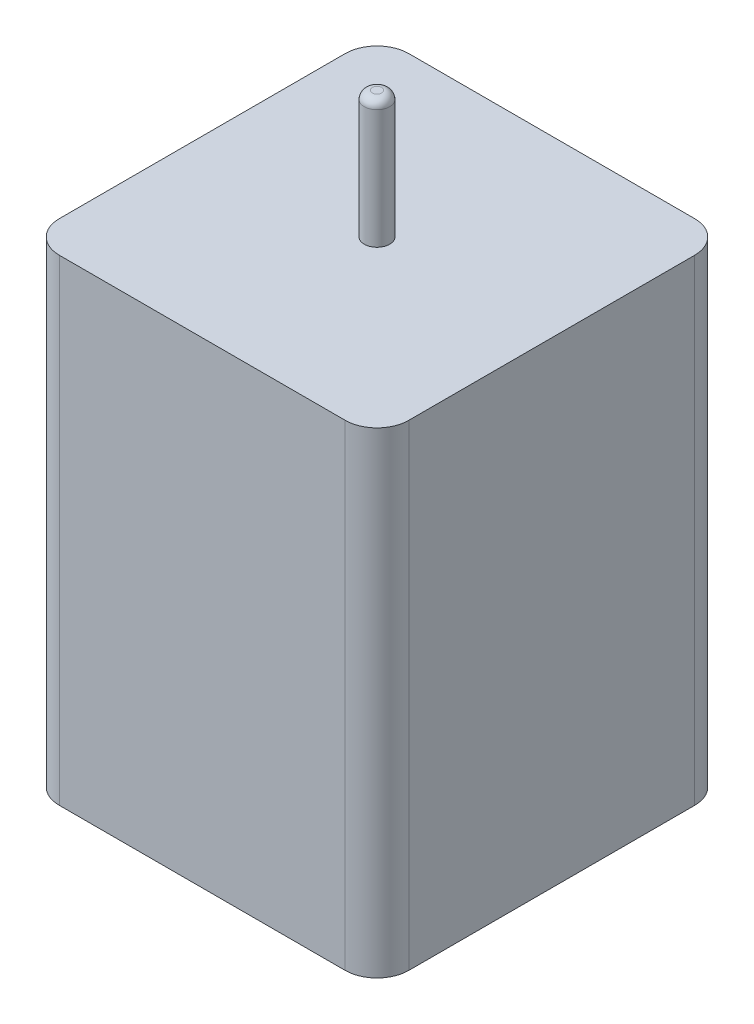
ISO-10303-21;
HEADER;
FILE_DESCRIPTION(('STEP AP214'),'2;1');
FILE_NAME('part.step','',(''),(''),'','','');
FILE_SCHEMA(('AUTOMOTIVE_DESIGN { 1 0 10303 214 1 1 1 1 }'));
ENDSEC;
DATA;
#1=APPLICATION_CONTEXT('core data for automotive mechanical design processes');
#2=APPLICATION_PROTOCOL_DEFINITION('international standard','automotive_design',2000,#1);
#3=PRODUCT_CONTEXT('',#1,'mechanical');
#4=PRODUCT('Part','Part','',(#3));
#5=PRODUCT_RELATED_PRODUCT_CATEGORY('part','',(#4));
#6=PRODUCT_DEFINITION_FORMATION('','',#4);
#7=PRODUCT_DEFINITION_CONTEXT('part definition',#1,'design');
#8=PRODUCT_DEFINITION('design','',#6,#7);
#9=PRODUCT_DEFINITION_SHAPE('','',#8);
#10=(LENGTH_UNIT() NAMED_UNIT(*) SI_UNIT(.MILLI.,.METRE.));
#11=(NAMED_UNIT(*) PLANE_ANGLE_UNIT() SI_UNIT($,.RADIAN.));
#12=(NAMED_UNIT(*) SI_UNIT($,.STERADIAN.) SOLID_ANGLE_UNIT());
#13=UNCERTAINTY_MEASURE_WITH_UNIT(LENGTH_MEASURE(1.E-05),#10,'distance_accuracy_value','');
#14=(GEOMETRIC_REPRESENTATION_CONTEXT(3) GLOBAL_UNCERTAINTY_ASSIGNED_CONTEXT((#13)) GLOBAL_UNIT_ASSIGNED_CONTEXT((#10,
#11,#12)) REPRESENTATION_CONTEXT('',''));
#15=CARTESIAN_POINT('',(0.,0.,0.));
#16=DIRECTION('',(0.,0.,1.));
#17=DIRECTION('',(1.,0.,0.));
#18=AXIS2_PLACEMENT_3D('',#15,#16,#17);
#19=CARTESIAN_POINT('',(-110.,300.,-110.));
#20=DIRECTION('',(1.,0.,0.));
#21=DIRECTION('',(0.,0.,-1.));
#22=AXIS2_PLACEMENT_3D('',#19,#20,#21);
#23=PLANE('',#22);
#24=DIRECTION('',(0.,0.,1.));
#25=VECTOR('',#24,1.);
#26=CARTESIAN_POINT('',(-110.,300.,-110.));
#27=LINE('',#26,#25);
#28=CARTESIAN_POINT('',(-110.,300.,-90.));
#29=VERTEX_POINT('',#28);
#30=CARTESIAN_POINT('',(-110.,300.,90.));
#31=VERTEX_POINT('',#30);
#32=EDGE_CURVE('E127',#29,#31,#27,.T.);
#33=ORIENTED_EDGE('',*,*,#32,.F.);
#34=DIRECTION('',(0.,-1.,0.));
#35=VECTOR('',#34,1.);
#36=CARTESIAN_POINT('',(-110.,300.,-90.));
#37=LINE('',#36,#35);
#38=CARTESIAN_POINT('',(-110.,0.,-90.));
#39=VERTEX_POINT('',#38);
#40=EDGE_CURVE('E112',#29,#39,#37,.T.);
#41=ORIENTED_EDGE('',*,*,#40,.T.);
#42=DIRECTION('',(0.,0.,1.));
#43=VECTOR('',#42,1.);
#44=CARTESIAN_POINT('',(-110.,0.,-110.));
#45=LINE('',#44,#43);
#46=CARTESIAN_POINT('',(-110.,0.,90.));
#47=VERTEX_POINT('',#46);
#48=EDGE_CURVE('E124',#39,#47,#45,.T.);
#49=ORIENTED_EDGE('',*,*,#48,.T.);
#50=DIRECTION('',(0.,-1.,0.));
#51=VECTOR('',#50,1.);
#52=CARTESIAN_POINT('',(-110.,300.,90.));
#53=LINE('',#52,#51);
#54=EDGE_CURVE('E129',#47,#31,#53,.F.);
#55=ORIENTED_EDGE('',*,*,#54,.T.);
#56=EDGE_LOOP('',(#33,#41,#49,#55));
#57=FACE_BOUND('',#56,.T.);
#58=ADVANCED_FACE('F41',(#57),#23,.F.);
#59=CARTESIAN_POINT('',(110.,300.,110.));
#60=DIRECTION('',(0.,0.,-1.));
#61=DIRECTION('',(-1.,0.,0.));
#62=AXIS2_PLACEMENT_3D('',#59,#60,#61);
#63=PLANE('',#62);
#64=DIRECTION('',(1.,0.,0.));
#65=VECTOR('',#64,1.);
#66=CARTESIAN_POINT('',(110.,0.,110.));
#67=LINE('',#66,#65);
#68=CARTESIAN_POINT('',(-90.,0.,110.));
#69=VERTEX_POINT('',#68);
#70=CARTESIAN_POINT('',(90.,0.,110.));
#71=VERTEX_POINT('',#70);
#72=EDGE_CURVE('E133',#69,#71,#67,.T.);
#73=ORIENTED_EDGE('',*,*,#72,.T.);
#74=DIRECTION('',(0.,-1.,0.));
#75=VECTOR('',#74,1.);
#76=CARTESIAN_POINT('',(90.,300.,110.));
#77=LINE('',#76,#75);
#78=CARTESIAN_POINT('',(90.,300.,110.));
#79=VERTEX_POINT('',#78);
#80=EDGE_CURVE('E170',#71,#79,#77,.F.);
#81=ORIENTED_EDGE('',*,*,#80,.T.);
#82=DIRECTION('',(1.,0.,0.));
#83=VECTOR('',#82,1.);
#84=CARTESIAN_POINT('',(110.,300.,110.));
#85=LINE('',#84,#83);
#86=CARTESIAN_POINT('',(-90.,300.,110.));
#87=VERTEX_POINT('',#86);
#88=EDGE_CURVE('E217',#87,#79,#85,.T.);
#89=ORIENTED_EDGE('',*,*,#88,.F.);
#90=DIRECTION('',(0.,-1.,0.));
#91=VECTOR('',#90,1.);
#92=CARTESIAN_POINT('',(-90.,300.,110.));
#93=LINE('',#92,#91);
#94=EDGE_CURVE('E167',#87,#69,#93,.T.);
#95=ORIENTED_EDGE('',*,*,#94,.T.);
#96=EDGE_LOOP('',(#73,#81,#89,#95));
#97=FACE_BOUND('',#96,.T.);
#98=ADVANCED_FACE('F187',(#97),#63,.F.);
#99=CARTESIAN_POINT('',(110.,300.,-110.));
#100=DIRECTION('',(-1.,0.,0.));
#101=DIRECTION('',(0.,0.,1.));
#102=AXIS2_PLACEMENT_3D('',#99,#100,#101);
#103=PLANE('',#102);
#104=DIRECTION('',(0.,0.,-1.));
#105=VECTOR('',#104,1.);
#106=CARTESIAN_POINT('',(110.,0.,-110.));
#107=LINE('',#106,#105);
#108=CARTESIAN_POINT('',(110.,0.,90.));
#109=VERTEX_POINT('',#108);
#110=CARTESIAN_POINT('',(110.,0.,-90.));
#111=VERTEX_POINT('',#110);
#112=EDGE_CURVE('E136',#109,#111,#107,.T.);
#113=ORIENTED_EDGE('',*,*,#112,.T.);
#114=DIRECTION('',(0.,-1.,0.));
#115=VECTOR('',#114,1.);
#116=CARTESIAN_POINT('',(110.,300.,-90.));
#117=LINE('',#116,#115);
#118=CARTESIAN_POINT('',(110.,300.,-90.));
#119=VERTEX_POINT('',#118);
#120=EDGE_CURVE('E56',#111,#119,#117,.F.);
#121=ORIENTED_EDGE('',*,*,#120,.T.);
#122=DIRECTION('',(0.,0.,-1.));
#123=VECTOR('',#122,1.);
#124=CARTESIAN_POINT('',(110.,300.,-110.));
#125=LINE('',#124,#123);
#126=CARTESIAN_POINT('',(110.,300.,90.));
#127=VERTEX_POINT('',#126);
#128=EDGE_CURVE('E210',#127,#119,#125,.T.);
#129=ORIENTED_EDGE('',*,*,#128,.F.);
#130=DIRECTION('',(0.,-1.,0.));
#131=VECTOR('',#130,1.);
#132=CARTESIAN_POINT('',(110.,300.,90.));
#133=LINE('',#132,#131);
#134=EDGE_CURVE('E163',#127,#109,#133,.T.);
#135=ORIENTED_EDGE('',*,*,#134,.T.);
#136=EDGE_LOOP('',(#113,#121,#129,#135));
#137=FACE_BOUND('',#136,.T.);
#138=ADVANCED_FACE('F192',(#137),#103,.F.);
#139=CARTESIAN_POINT('',(110.,300.,-110.));
#140=DIRECTION('',(0.,0.,1.));
#141=DIRECTION('',(1.,0.,0.));
#142=AXIS2_PLACEMENT_3D('',#139,#140,#141);
#143=PLANE('',#142);
#144=DIRECTION('',(-1.,0.,0.));
#145=VECTOR('',#144,1.);
#146=CARTESIAN_POINT('',(110.,0.,-110.));
#147=LINE('',#146,#145);
#148=CARTESIAN_POINT('',(90.,0.,-110.));
#149=VERTEX_POINT('',#148);
#150=CARTESIAN_POINT('',(-90.,0.,-110.));
#151=VERTEX_POINT('',#150);
#152=EDGE_CURVE('E143',#149,#151,#147,.T.);
#153=ORIENTED_EDGE('',*,*,#152,.T.);
#154=DIRECTION('',(0.,-1.,0.));
#155=VECTOR('',#154,1.);
#156=CARTESIAN_POINT('',(-90.,300.,-110.));
#157=LINE('',#156,#155);
#158=CARTESIAN_POINT('',(-90.,300.,-110.));
#159=VERTEX_POINT('',#158);
#160=EDGE_CURVE('E113',#151,#159,#157,.F.);
#161=ORIENTED_EDGE('',*,*,#160,.T.);
#162=DIRECTION('',(-1.,0.,0.));
#163=VECTOR('',#162,1.);
#164=CARTESIAN_POINT('',(110.,300.,-110.));
#165=LINE('',#164,#163);
#166=CARTESIAN_POINT('',(90.,300.,-110.));
#167=VERTEX_POINT('',#166);
#168=EDGE_CURVE('E139',#167,#159,#165,.T.);
#169=ORIENTED_EDGE('',*,*,#168,.F.);
#170=DIRECTION('',(0.,-1.,0.));
#171=VECTOR('',#170,1.);
#172=CARTESIAN_POINT('',(90.,300.,-110.));
#173=LINE('',#172,#171);
#174=EDGE_CURVE('E118',#167,#149,#173,.T.);
#175=ORIENTED_EDGE('',*,*,#174,.T.);
#176=EDGE_LOOP('',(#153,#161,#169,#175));
#177=FACE_BOUND('',#176,.T.);
#178=ADVANCED_FACE('F215',(#177),#143,.F.);
#179=CARTESIAN_POINT('',(0.,300.,0.));
#180=DIRECTION('',(0.,-1.,0.));
#181=DIRECTION('',(0.,0.,-1.));
#182=AXIS2_PLACEMENT_3D('',#179,#180,#181);
#183=PLANE('',#182);
#184=CARTESIAN_POINT('',(0.,300.,0.));
#185=DIRECTION('',(0.,-1.,0.));
#186=DIRECTION('',(0.,0.,-1.));
#187=AXIS2_PLACEMENT_3D('',#184,#185,#186);
#188=CIRCLE('',#187,8.);
#189=CARTESIAN_POINT('',(0.,300.,-8.));
#190=VERTEX_POINT('',#189);
#191=EDGE_CURVE('E145',#190,#190,#188,.F.);
#192=ORIENTED_EDGE('',*,*,#191,.F.);
#193=EDGE_LOOP('',(#192));
#194=FACE_BOUND('',#193,.T.);
#195=ORIENTED_EDGE('',*,*,#168,.T.);
#196=CARTESIAN_POINT('',(-90.,300.,-90.));
#197=DIRECTION('',(0.,-1.,0.));
#198=DIRECTION('',(0.,0.,-1.));
#199=AXIS2_PLACEMENT_3D('',#196,#197,#198);
#200=CIRCLE('',#199,20.);
#201=EDGE_CURVE('E161',#159,#29,#200,.F.);
#202=ORIENTED_EDGE('',*,*,#201,.T.);
#203=ORIENTED_EDGE('',*,*,#32,.T.);
#204=CARTESIAN_POINT('',(-90.,300.,90.));
#205=DIRECTION('',(0.,-1.,0.));
#206=DIRECTION('',(0.,0.,-1.));
#207=AXIS2_PLACEMENT_3D('',#204,#205,#206);
#208=CIRCLE('',#207,20.);
#209=EDGE_CURVE('E156',#31,#87,#208,.F.);
#210=ORIENTED_EDGE('',*,*,#209,.T.);
#211=ORIENTED_EDGE('',*,*,#88,.T.);
#212=CARTESIAN_POINT('',(90.,300.,90.));
#213=DIRECTION('',(0.,-1.,0.));
#214=DIRECTION('',(0.,0.,-1.));
#215=AXIS2_PLACEMENT_3D('',#212,#213,#214);
#216=CIRCLE('',#215,20.);
#217=EDGE_CURVE('E63',#79,#127,#216,.F.);
#218=ORIENTED_EDGE('',*,*,#217,.T.);
#219=ORIENTED_EDGE('',*,*,#128,.T.);
#220=CARTESIAN_POINT('',(90.,300.,-90.));
#221=DIRECTION('',(0.,-1.,0.));
#222=DIRECTION('',(0.,0.,-1.));
#223=AXIS2_PLACEMENT_3D('',#220,#221,#222);
#224=CIRCLE('',#223,20.);
#225=EDGE_CURVE('E159',#119,#167,#224,.F.);
#226=ORIENTED_EDGE('',*,*,#225,.T.);
#227=EDGE_LOOP('',(#195,#202,#203,#210,#211,#218,#219,#226));
#228=FACE_BOUND('',#227,.T.);
#229=ADVANCED_FACE('F221',(#194,#228),#183,.F.);
#230=CARTESIAN_POINT('',(0.,0.,0.));
#231=DIRECTION('',(0.,-1.,0.));
#232=DIRECTION('',(0.,0.,-1.));
#233=AXIS2_PLACEMENT_3D('',#230,#231,#232);
#234=PLANE('',#233);
#235=ORIENTED_EDGE('',*,*,#48,.F.);
#236=CARTESIAN_POINT('',(-90.,0.,-90.));
#237=DIRECTION('',(0.,-1.,0.));
#238=DIRECTION('',(0.,0.,-1.));
#239=AXIS2_PLACEMENT_3D('',#236,#237,#238);
#240=CIRCLE('',#239,20.);
#241=EDGE_CURVE('E108',#39,#151,#240,.T.);
#242=ORIENTED_EDGE('',*,*,#241,.T.);
#243=ORIENTED_EDGE('',*,*,#152,.F.);
#244=CARTESIAN_POINT('',(90.,0.,-90.));
#245=DIRECTION('',(0.,-1.,0.));
#246=DIRECTION('',(0.,0.,-1.));
#247=AXIS2_PLACEMENT_3D('',#244,#245,#246);
#248=CIRCLE('',#247,20.);
#249=EDGE_CURVE('E119',#149,#111,#248,.T.);
#250=ORIENTED_EDGE('',*,*,#249,.T.);
#251=ORIENTED_EDGE('',*,*,#112,.F.);
#252=CARTESIAN_POINT('',(90.,0.,90.));
#253=DIRECTION('',(0.,-1.,0.));
#254=DIRECTION('',(0.,0.,-1.));
#255=AXIS2_PLACEMENT_3D('',#252,#253,#254);
#256=CIRCLE('',#255,20.);
#257=EDGE_CURVE('E150',#109,#71,#256,.T.);
#258=ORIENTED_EDGE('',*,*,#257,.T.);
#259=ORIENTED_EDGE('',*,*,#72,.F.);
#260=CARTESIAN_POINT('',(-90.,0.,90.));
#261=DIRECTION('',(0.,-1.,0.));
#262=DIRECTION('',(0.,0.,-1.));
#263=AXIS2_PLACEMENT_3D('',#260,#261,#262);
#264=CIRCLE('',#263,20.);
#265=EDGE_CURVE('E128',#69,#47,#264,.T.);
#266=ORIENTED_EDGE('',*,*,#265,.T.);
#267=EDGE_LOOP('',(#235,#242,#243,#250,#251,#258,#259,#266));
#268=FACE_BOUND('',#267,.T.);
#269=ADVANCED_FACE('F131',(#268),#234,.T.);
#270=CARTESIAN_POINT('',(0.,380.,0.));
#271=DIRECTION('',(0.,-1.,0.));
#272=DIRECTION('',(0.,0.,-1.));
#273=AXIS2_PLACEMENT_3D('',#270,#271,#272);
#274=CYLINDRICAL_SURFACE('',#273,8.);
#275=CARTESIAN_POINT('',(0.,375.,0.));
#276=DIRECTION('',(0.,1.,0.));
#277=DIRECTION('',(0.,0.,1.));
#278=AXIS2_PLACEMENT_3D('',#275,#276,#277);
#279=CIRCLE('',#278,8.);
#280=CARTESIAN_POINT('',(0.,375.,8.));
#281=VERTEX_POINT('',#280);
#282=EDGE_CURVE('E11',#281,#281,#279,.F.);
#283=ORIENTED_EDGE('',*,*,#282,.T.);
#284=EDGE_LOOP('',(#283));
#285=FACE_BOUND('',#284,.T.);
#286=ORIENTED_EDGE('',*,*,#191,.T.);
#287=EDGE_LOOP('',(#286));
#288=FACE_BOUND('',#287,.T.);
#289=ADVANCED_FACE('F231',(#285,#288),#274,.T.);
#290=CARTESIAN_POINT('',(0.,380.,0.));
#291=DIRECTION('',(0.,1.,0.));
#292=DIRECTION('',(0.,0.,1.));
#293=AXIS2_PLACEMENT_3D('',#290,#291,#292);
#294=PLANE('',#293);
#295=CARTESIAN_POINT('',(0.,380.,0.));
#296=DIRECTION('',(0.,1.,0.));
#297=DIRECTION('',(0.,0.,1.));
#298=AXIS2_PLACEMENT_3D('',#295,#296,#297);
#299=CIRCLE('',#298,3.);
#300=CARTESIAN_POINT('',(0.,380.,3.));
#301=VERTEX_POINT('',#300);
#302=EDGE_CURVE('E49',#301,#301,#299,.T.);
#303=ORIENTED_EDGE('',*,*,#302,.T.);
#304=EDGE_LOOP('',(#303));
#305=FACE_BOUND('',#304,.T.);
#306=ADVANCED_FACE('F174',(#305),#294,.T.);
#307=CARTESIAN_POINT('',(-90.,300.,-90.));
#308=DIRECTION('',(0.,-1.,0.));
#309=DIRECTION('',(0.,0.,-1.));
#310=AXIS2_PLACEMENT_3D('',#307,#308,#309);
#311=CYLINDRICAL_SURFACE('',#310,20.);
#312=ORIENTED_EDGE('',*,*,#201,.F.);
#313=ORIENTED_EDGE('',*,*,#160,.F.);
#314=ORIENTED_EDGE('',*,*,#241,.F.);
#315=ORIENTED_EDGE('',*,*,#40,.F.);
#316=EDGE_LOOP('',(#312,#313,#314,#315));
#317=FACE_BOUND('',#316,.T.);
#318=ADVANCED_FACE('F111',(#317),#311,.T.);
#319=CARTESIAN_POINT('',(90.,300.,-90.));
#320=DIRECTION('',(0.,-1.,0.));
#321=DIRECTION('',(0.,0.,-1.));
#322=AXIS2_PLACEMENT_3D('',#319,#320,#321);
#323=CYLINDRICAL_SURFACE('',#322,20.);
#324=ORIENTED_EDGE('',*,*,#225,.F.);
#325=ORIENTED_EDGE('',*,*,#120,.F.);
#326=ORIENTED_EDGE('',*,*,#249,.F.);
#327=ORIENTED_EDGE('',*,*,#174,.F.);
#328=EDGE_LOOP('',(#324,#325,#326,#327));
#329=FACE_BOUND('',#328,.T.);
#330=ADVANCED_FACE('F199',(#329),#323,.T.);
#331=CARTESIAN_POINT('',(90.,300.,90.));
#332=DIRECTION('',(0.,-1.,0.));
#333=DIRECTION('',(0.,0.,-1.));
#334=AXIS2_PLACEMENT_3D('',#331,#332,#333);
#335=CYLINDRICAL_SURFACE('',#334,20.);
#336=ORIENTED_EDGE('',*,*,#217,.F.);
#337=ORIENTED_EDGE('',*,*,#80,.F.);
#338=ORIENTED_EDGE('',*,*,#257,.F.);
#339=ORIENTED_EDGE('',*,*,#134,.F.);
#340=EDGE_LOOP('',(#336,#337,#338,#339));
#341=FACE_BOUND('',#340,.T.);
#342=ADVANCED_FACE('F183',(#341),#335,.T.);
#343=CARTESIAN_POINT('',(-90.,300.,90.));
#344=DIRECTION('',(0.,-1.,0.));
#345=DIRECTION('',(0.,0.,-1.));
#346=AXIS2_PLACEMENT_3D('',#343,#344,#345);
#347=CYLINDRICAL_SURFACE('',#346,20.);
#348=ORIENTED_EDGE('',*,*,#209,.F.);
#349=ORIENTED_EDGE('',*,*,#54,.F.);
#350=ORIENTED_EDGE('',*,*,#265,.F.);
#351=ORIENTED_EDGE('',*,*,#94,.F.);
#352=EDGE_LOOP('',(#348,#349,#350,#351));
#353=FACE_BOUND('',#352,.T.);
#354=ADVANCED_FACE('F177',(#353),#347,.T.);
#355=CARTESIAN_POINT('',(0.,375.,0.));
#356=DIRECTION('',(0.,1.,0.));
#357=DIRECTION('',(0.,0.,1.));
#358=AXIS2_PLACEMENT_3D('',#355,#356,#357);
#359=DEGENERATE_TOROIDAL_SURFACE('',#358,3.,5.,.T.);
#360=ORIENTED_EDGE('',*,*,#282,.F.);
#361=EDGE_LOOP('',(#360));
#362=FACE_BOUND('',#361,.T.);
#363=ORIENTED_EDGE('',*,*,#302,.F.);
#364=EDGE_LOOP('',(#363));
#365=FACE_BOUND('',#364,.T.);
#366=ADVANCED_FACE('F43',(#362,#365),#359,.T.);
#367=CLOSED_SHELL('',(#58,#98,#138,#178,#229,#269,#289,#306,#318,#330,#342,#354,#366));
#368=MANIFOLD_SOLID_BREP('B2',#367);
#369=ADVANCED_BREP_SHAPE_REPRESENTATION('',(#18,#368),#14);
#370=SHAPE_DEFINITION_REPRESENTATION(#9,#369);
ENDSEC;
END-ISO-10303-21;
